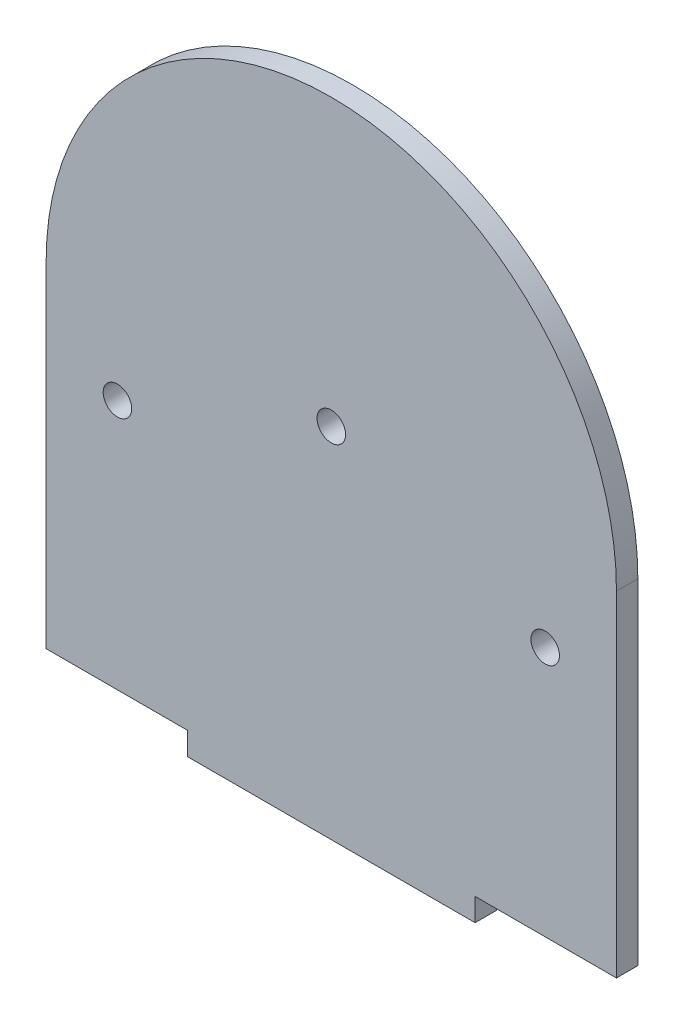
ISO-10303-21;
HEADER;
FILE_DESCRIPTION(('STEP AP214'),'2;1');
FILE_NAME('part.step','',(''),(''),'','','');
FILE_SCHEMA(('AUTOMOTIVE_DESIGN { 1 0 10303 214 1 1 1 1 }'));
ENDSEC;
DATA;
#1=APPLICATION_CONTEXT('core data for automotive mechanical design processes');
#2=APPLICATION_PROTOCOL_DEFINITION('international standard','automotive_design',2000,#1);
#3=PRODUCT_CONTEXT('',#1,'mechanical');
#4=PRODUCT('Part','Part','',(#3));
#5=PRODUCT_RELATED_PRODUCT_CATEGORY('part','',(#4));
#6=PRODUCT_DEFINITION_FORMATION('','',#4);
#7=PRODUCT_DEFINITION_CONTEXT('part definition',#1,'design');
#8=PRODUCT_DEFINITION('design','',#6,#7);
#9=PRODUCT_DEFINITION_SHAPE('','',#8);
#10=(LENGTH_UNIT() NAMED_UNIT(*) SI_UNIT(.MILLI.,.METRE.));
#11=(NAMED_UNIT(*) PLANE_ANGLE_UNIT() SI_UNIT($,.RADIAN.));
#12=(NAMED_UNIT(*) SI_UNIT($,.STERADIAN.) SOLID_ANGLE_UNIT());
#13=UNCERTAINTY_MEASURE_WITH_UNIT(LENGTH_MEASURE(1.E-05),#10,'distance_accuracy_value','');
#14=(GEOMETRIC_REPRESENTATION_CONTEXT(3) GLOBAL_UNCERTAINTY_ASSIGNED_CONTEXT((#13)) GLOBAL_UNIT_ASSIGNED_CONTEXT((#10,
#11,#12)) REPRESENTATION_CONTEXT('',''));
#15=CARTESIAN_POINT('',(0.,0.,0.));
#16=DIRECTION('',(0.,0.,1.));
#17=DIRECTION('',(1.,0.,0.));
#18=AXIS2_PLACEMENT_3D('',#15,#16,#17);
#19=CARTESIAN_POINT('',(0.,0.,3.));
#20=DIRECTION('',(0.,0.,1.));
#21=DIRECTION('',(1.,0.,0.));
#22=AXIS2_PLACEMENT_3D('',#19,#20,#21);
#23=PLANE('',#22);
#24=CARTESIAN_POINT('',(-30.,-11.85,3.));
#25=DIRECTION('',(0.,0.,1.));
#26=DIRECTION('',(1.,0.,0.));
#27=AXIS2_PLACEMENT_3D('',#24,#25,#26);
#28=CIRCLE('',#27,2.);
#29=CARTESIAN_POINT('',(-28.,-11.85,3.));
#30=VERTEX_POINT('',#29);
#31=EDGE_CURVE('E217',#30,#30,#28,.T.);
#32=ORIENTED_EDGE('',*,*,#31,.F.);
#33=EDGE_LOOP('',(#32));
#34=FACE_BOUND('',#33,.T.);
#35=DIRECTION('',(1.,0.,0.));
#36=VECTOR('',#35,1.);
#37=CARTESIAN_POINT('',(-20.175,-50.2,3.));
#38=LINE('',#37,#36);
#39=CARTESIAN_POINT('',(-20.175,-50.2,3.));
#40=VERTEX_POINT('',#39);
#41=CARTESIAN_POINT('',(20.175,-50.2,3.));
#42=VERTEX_POINT('',#41);
#43=EDGE_CURVE('E169',#40,#42,#38,.T.);
#44=ORIENTED_EDGE('',*,*,#43,.T.);
#45=DIRECTION('',(0.,1.,0.));
#46=VECTOR('',#45,1.);
#47=CARTESIAN_POINT('',(20.175,-50.2,3.));
#48=LINE('',#47,#46);
#49=CARTESIAN_POINT('',(20.175,-47.,3.));
#50=VERTEX_POINT('',#49);
#51=EDGE_CURVE('E104',#42,#50,#48,.T.);
#52=ORIENTED_EDGE('',*,*,#51,.T.);
#53=DIRECTION('',(1.,0.,0.));
#54=VECTOR('',#53,1.);
#55=CARTESIAN_POINT('',(20.175,-47.,3.));
#56=LINE('',#55,#54);
#57=CARTESIAN_POINT('',(40.,-47.,3.));
#58=VERTEX_POINT('',#57);
#59=EDGE_CURVE('E190',#50,#58,#56,.T.);
#60=ORIENTED_EDGE('',*,*,#59,.T.);
#61=DIRECTION('',(0.,1.,0.));
#62=VECTOR('',#61,1.);
#63=CARTESIAN_POINT('',(40.,0.,3.));
#64=LINE('',#63,#62);
#65=CARTESIAN_POINT('',(40.,0.,3.));
#66=VERTEX_POINT('',#65);
#67=EDGE_CURVE('E203',#58,#66,#64,.T.);
#68=ORIENTED_EDGE('',*,*,#67,.T.);
#69=CARTESIAN_POINT('',(0.,0.,3.));
#70=DIRECTION('',(0.,0.,1.));
#71=DIRECTION('',(1.,0.,0.));
#72=AXIS2_PLACEMENT_3D('',#69,#70,#71);
#73=CIRCLE('',#72,40.);
#74=CARTESIAN_POINT('',(-40.,0.,3.));
#75=VERTEX_POINT('',#74);
#76=EDGE_CURVE('E123',#66,#75,#73,.T.);
#77=ORIENTED_EDGE('',*,*,#76,.T.);
#78=DIRECTION('',(0.,-1.,0.));
#79=VECTOR('',#78,1.);
#80=CARTESIAN_POINT('',(-40.,0.,3.));
#81=LINE('',#80,#79);
#82=CARTESIAN_POINT('',(-40.,-47.,3.));
#83=VERTEX_POINT('',#82);
#84=EDGE_CURVE('E117',#75,#83,#81,.T.);
#85=ORIENTED_EDGE('',*,*,#84,.T.);
#86=DIRECTION('',(1.,0.,0.));
#87=VECTOR('',#86,1.);
#88=CARTESIAN_POINT('',(-40.,-47.,3.));
#89=LINE('',#88,#87);
#90=CARTESIAN_POINT('',(-20.175,-47.,3.));
#91=VERTEX_POINT('',#90);
#92=EDGE_CURVE('E121',#83,#91,#89,.T.);
#93=ORIENTED_EDGE('',*,*,#92,.T.);
#94=DIRECTION('',(0.,-1.,0.));
#95=VECTOR('',#94,1.);
#96=CARTESIAN_POINT('',(-20.175,-47.,3.));
#97=LINE('',#96,#95);
#98=EDGE_CURVE('E61',#91,#40,#97,.T.);
#99=ORIENTED_EDGE('',*,*,#98,.T.);
#100=EDGE_LOOP('',(#44,#52,#60,#68,#77,#85,#93,#99));
#101=FACE_BOUND('',#100,.T.);
#102=CARTESIAN_POINT('',(0.,0.,3.));
#103=DIRECTION('',(0.,0.,1.));
#104=DIRECTION('',(1.,0.,0.));
#105=AXIS2_PLACEMENT_3D('',#102,#103,#104);
#106=CIRCLE('',#105,2.);
#107=CARTESIAN_POINT('',(2.,0.,3.));
#108=VERTEX_POINT('',#107);
#109=EDGE_CURVE('E150',#108,#108,#106,.T.);
#110=ORIENTED_EDGE('',*,*,#109,.F.);
#111=EDGE_LOOP('',(#110));
#112=FACE_BOUND('',#111,.T.);
#113=CARTESIAN_POINT('',(30.,-11.85,3.));
#114=DIRECTION('',(0.,0.,1.));
#115=DIRECTION('',(-1.,0.,0.));
#116=AXIS2_PLACEMENT_3D('',#113,#114,#115);
#117=CIRCLE('',#116,2.);
#118=CARTESIAN_POINT('',(28.,-11.85,3.));
#119=VERTEX_POINT('',#118);
#120=EDGE_CURVE('E225',#119,#119,#117,.T.);
#121=ORIENTED_EDGE('',*,*,#120,.F.);
#122=EDGE_LOOP('',(#121));
#123=FACE_BOUND('',#122,.T.);
#124=ADVANCED_FACE('F43',(#34,#101,#112,#123),#23,.T.);
#125=CARTESIAN_POINT('',(0.,0.,0.));
#126=DIRECTION('',(0.,0.,1.));
#127=DIRECTION('',(1.,0.,0.));
#128=AXIS2_PLACEMENT_3D('',#125,#126,#127);
#129=PLANE('',#128);
#130=DIRECTION('',(1.,0.,0.));
#131=VECTOR('',#130,1.);
#132=CARTESIAN_POINT('',(-20.175,-50.2,0.));
#133=LINE('',#132,#131);
#134=CARTESIAN_POINT('',(-20.175,-50.2,0.));
#135=VERTEX_POINT('',#134);
#136=CARTESIAN_POINT('',(20.175,-50.2,0.));
#137=VERTEX_POINT('',#136);
#138=EDGE_CURVE('E145',#135,#137,#133,.T.);
#139=ORIENTED_EDGE('',*,*,#138,.F.);
#140=DIRECTION('',(0.,-1.,0.));
#141=VECTOR('',#140,1.);
#142=CARTESIAN_POINT('',(-20.175,-47.,0.));
#143=LINE('',#142,#141);
#144=CARTESIAN_POINT('',(-20.175,-47.,0.));
#145=VERTEX_POINT('',#144);
#146=EDGE_CURVE('E96',#145,#135,#143,.T.);
#147=ORIENTED_EDGE('',*,*,#146,.F.);
#148=DIRECTION('',(1.,0.,0.));
#149=VECTOR('',#148,1.);
#150=CARTESIAN_POINT('',(-40.,-47.,0.));
#151=LINE('',#150,#149);
#152=CARTESIAN_POINT('',(-40.,-47.,0.));
#153=VERTEX_POINT('',#152);
#154=EDGE_CURVE('E90',#153,#145,#151,.T.);
#155=ORIENTED_EDGE('',*,*,#154,.F.);
#156=DIRECTION('',(0.,-1.,0.));
#157=VECTOR('',#156,1.);
#158=CARTESIAN_POINT('',(-40.,0.,0.));
#159=LINE('',#158,#157);
#160=CARTESIAN_POINT('',(-40.,0.,0.));
#161=VERTEX_POINT('',#160);
#162=EDGE_CURVE('E132',#161,#153,#159,.T.);
#163=ORIENTED_EDGE('',*,*,#162,.F.);
#164=CARTESIAN_POINT('',(0.,0.,0.));
#165=DIRECTION('',(0.,0.,1.));
#166=DIRECTION('',(-1.,0.,0.));
#167=AXIS2_PLACEMENT_3D('',#164,#165,#166);
#168=CIRCLE('',#167,40.);
#169=CARTESIAN_POINT('',(40.,0.,0.));
#170=VERTEX_POINT('',#169);
#171=EDGE_CURVE('E160',#170,#161,#168,.T.);
#172=ORIENTED_EDGE('',*,*,#171,.F.);
#173=DIRECTION('',(0.,1.,0.));
#174=VECTOR('',#173,1.);
#175=CARTESIAN_POINT('',(40.,0.,0.));
#176=LINE('',#175,#174);
#177=CARTESIAN_POINT('',(40.,-47.,0.));
#178=VERTEX_POINT('',#177);
#179=EDGE_CURVE('E156',#178,#170,#176,.T.);
#180=ORIENTED_EDGE('',*,*,#179,.F.);
#181=DIRECTION('',(1.,0.,0.));
#182=VECTOR('',#181,1.);
#183=CARTESIAN_POINT('',(20.175,-47.,0.));
#184=LINE('',#183,#182);
#185=CARTESIAN_POINT('',(20.175,-47.,0.));
#186=VERTEX_POINT('',#185);
#187=EDGE_CURVE('E153',#186,#178,#184,.T.);
#188=ORIENTED_EDGE('',*,*,#187,.F.);
#189=DIRECTION('',(0.,1.,0.));
#190=VECTOR('',#189,1.);
#191=CARTESIAN_POINT('',(20.175,-50.2,0.));
#192=LINE('',#191,#190);
#193=EDGE_CURVE('E149',#137,#186,#192,.T.);
#194=ORIENTED_EDGE('',*,*,#193,.F.);
#195=EDGE_LOOP('',(#139,#147,#155,#163,#172,#180,#188,#194));
#196=FACE_BOUND('',#195,.T.);
#197=CARTESIAN_POINT('',(0.,0.,0.));
#198=DIRECTION('',(0.,0.,1.));
#199=DIRECTION('',(1.,0.,0.));
#200=AXIS2_PLACEMENT_3D('',#197,#198,#199);
#201=CIRCLE('',#200,2.);
#202=CARTESIAN_POINT('',(2.,0.,0.));
#203=VERTEX_POINT('',#202);
#204=EDGE_CURVE('E213',#203,#203,#201,.T.);
#205=ORIENTED_EDGE('',*,*,#204,.T.);
#206=EDGE_LOOP('',(#205));
#207=FACE_BOUND('',#206,.T.);
#208=CARTESIAN_POINT('',(-30.,-11.85,0.));
#209=DIRECTION('',(0.,0.,1.));
#210=DIRECTION('',(1.,0.,0.));
#211=AXIS2_PLACEMENT_3D('',#208,#209,#210);
#212=CIRCLE('',#211,2.);
#213=CARTESIAN_POINT('',(-28.,-11.85,0.));
#214=VERTEX_POINT('',#213);
#215=EDGE_CURVE('E221',#214,#214,#212,.T.);
#216=ORIENTED_EDGE('',*,*,#215,.T.);
#217=EDGE_LOOP('',(#216));
#218=FACE_BOUND('',#217,.T.);
#219=CARTESIAN_POINT('',(30.,-11.85,0.));
#220=DIRECTION('',(0.,0.,1.));
#221=DIRECTION('',(-1.,0.,0.));
#222=AXIS2_PLACEMENT_3D('',#219,#220,#221);
#223=CIRCLE('',#222,2.);
#224=CARTESIAN_POINT('',(28.,-11.85,0.));
#225=VERTEX_POINT('',#224);
#226=EDGE_CURVE('E229',#225,#225,#223,.T.);
#227=ORIENTED_EDGE('',*,*,#226,.T.);
#228=EDGE_LOOP('',(#227));
#229=FACE_BOUND('',#228,.T.);
#230=ADVANCED_FACE('F194',(#196,#207,#218,#229),#129,.F.);
#231=CARTESIAN_POINT('',(-20.175,-50.2,3.));
#232=DIRECTION('',(0.,1.,0.));
#233=DIRECTION('',(-1.,0.,0.));
#234=AXIS2_PLACEMENT_3D('',#231,#232,#233);
#235=PLANE('',#234);
#236=ORIENTED_EDGE('',*,*,#138,.T.);
#237=DIRECTION('',(0.,0.,-1.));
#238=VECTOR('',#237,1.);
#239=CARTESIAN_POINT('',(20.175,-50.2,3.));
#240=LINE('',#239,#238);
#241=EDGE_CURVE('E11',#42,#137,#240,.T.);
#242=ORIENTED_EDGE('',*,*,#241,.F.);
#243=ORIENTED_EDGE('',*,*,#43,.F.);
#244=DIRECTION('',(0.,0.,-1.));
#245=VECTOR('',#244,1.);
#246=CARTESIAN_POINT('',(-20.175,-50.2,3.));
#247=LINE('',#246,#245);
#248=EDGE_CURVE('E141',#40,#135,#247,.T.);
#249=ORIENTED_EDGE('',*,*,#248,.T.);
#250=EDGE_LOOP('',(#236,#242,#243,#249));
#251=FACE_BOUND('',#250,.T.);
#252=ADVANCED_FACE('F45',(#251),#235,.F.);
#253=CARTESIAN_POINT('',(20.175,-50.2,3.));
#254=DIRECTION('',(-1.,0.,0.));
#255=DIRECTION('',(0.,-1.,0.));
#256=AXIS2_PLACEMENT_3D('',#253,#254,#255);
#257=PLANE('',#256);
#258=ORIENTED_EDGE('',*,*,#193,.T.);
#259=DIRECTION('',(0.,0.,-1.));
#260=VECTOR('',#259,1.);
#261=CARTESIAN_POINT('',(20.175,-47.,3.));
#262=LINE('',#261,#260);
#263=EDGE_CURVE('E53',#50,#186,#262,.T.);
#264=ORIENTED_EDGE('',*,*,#263,.F.);
#265=ORIENTED_EDGE('',*,*,#51,.F.);
#266=ORIENTED_EDGE('',*,*,#241,.T.);
#267=EDGE_LOOP('',(#258,#264,#265,#266));
#268=FACE_BOUND('',#267,.T.);
#269=ADVANCED_FACE('F264',(#268),#257,.F.);
#270=CARTESIAN_POINT('',(20.175,-47.,3.));
#271=DIRECTION('',(0.,1.,0.));
#272=DIRECTION('',(0.,0.,1.));
#273=AXIS2_PLACEMENT_3D('',#270,#271,#272);
#274=PLANE('',#273);
#275=ORIENTED_EDGE('',*,*,#187,.T.);
#276=DIRECTION('',(0.,0.,-1.));
#277=VECTOR('',#276,1.);
#278=CARTESIAN_POINT('',(40.,-47.,3.));
#279=LINE('',#278,#277);
#280=EDGE_CURVE('E180',#58,#178,#279,.T.);
#281=ORIENTED_EDGE('',*,*,#280,.F.);
#282=ORIENTED_EDGE('',*,*,#59,.F.);
#283=ORIENTED_EDGE('',*,*,#263,.T.);
#284=EDGE_LOOP('',(#275,#281,#282,#283));
#285=FACE_BOUND('',#284,.T.);
#286=ADVANCED_FACE('F188',(#285),#274,.F.);
#287=CARTESIAN_POINT('',(40.,0.,3.));
#288=DIRECTION('',(-1.,0.,0.));
#289=DIRECTION('',(0.,-1.,0.));
#290=AXIS2_PLACEMENT_3D('',#287,#288,#289);
#291=PLANE('',#290);
#292=ORIENTED_EDGE('',*,*,#179,.T.);
#293=DIRECTION('',(0.,0.,-1.));
#294=VECTOR('',#293,1.);
#295=CARTESIAN_POINT('',(40.,0.,3.));
#296=LINE('',#295,#294);
#297=EDGE_CURVE('E176',#66,#170,#296,.T.);
#298=ORIENTED_EDGE('',*,*,#297,.F.);
#299=ORIENTED_EDGE('',*,*,#67,.F.);
#300=ORIENTED_EDGE('',*,*,#280,.T.);
#301=EDGE_LOOP('',(#292,#298,#299,#300));
#302=FACE_BOUND('',#301,.T.);
#303=ADVANCED_FACE('F198',(#302),#291,.F.);
#304=CARTESIAN_POINT('',(0.,0.,3.));
#305=DIRECTION('',(0.,0.,-1.));
#306=DIRECTION('',(-1.,0.,0.));
#307=AXIS2_PLACEMENT_3D('',#304,#305,#306);
#308=CYLINDRICAL_SURFACE('',#307,40.);
#309=ORIENTED_EDGE('',*,*,#171,.T.);
#310=DIRECTION('',(0.,0.,-1.));
#311=VECTOR('',#310,1.);
#312=CARTESIAN_POINT('',(-40.,0.,3.));
#313=LINE('',#312,#311);
#314=EDGE_CURVE('E134',#75,#161,#313,.T.);
#315=ORIENTED_EDGE('',*,*,#314,.F.);
#316=ORIENTED_EDGE('',*,*,#76,.F.);
#317=ORIENTED_EDGE('',*,*,#297,.T.);
#318=EDGE_LOOP('',(#309,#315,#316,#317));
#319=FACE_BOUND('',#318,.T.);
#320=ADVANCED_FACE('F201',(#319),#308,.T.);
#321=CARTESIAN_POINT('',(-40.,0.,3.));
#322=DIRECTION('',(1.,0.,0.));
#323=DIRECTION('',(0.,0.,-1.));
#324=AXIS2_PLACEMENT_3D('',#321,#322,#323);
#325=PLANE('',#324);
#326=ORIENTED_EDGE('',*,*,#162,.T.);
#327=DIRECTION('',(0.,0.,-1.));
#328=VECTOR('',#327,1.);
#329=CARTESIAN_POINT('',(-40.,-47.,3.));
#330=LINE('',#329,#328);
#331=EDGE_CURVE('E129',#83,#153,#330,.T.);
#332=ORIENTED_EDGE('',*,*,#331,.F.);
#333=ORIENTED_EDGE('',*,*,#84,.F.);
#334=ORIENTED_EDGE('',*,*,#314,.T.);
#335=EDGE_LOOP('',(#326,#332,#333,#334));
#336=FACE_BOUND('',#335,.T.);
#337=ADVANCED_FACE('F130',(#336),#325,.F.);
#338=CARTESIAN_POINT('',(-40.,-47.,3.));
#339=DIRECTION('',(0.,1.,0.));
#340=DIRECTION('',(0.,0.,1.));
#341=AXIS2_PLACEMENT_3D('',#338,#339,#340);
#342=PLANE('',#341);
#343=ORIENTED_EDGE('',*,*,#154,.T.);
#344=DIRECTION('',(0.,0.,-1.));
#345=VECTOR('',#344,1.);
#346=CARTESIAN_POINT('',(-20.175,-47.,3.));
#347=LINE('',#346,#345);
#348=EDGE_CURVE('E135',#91,#145,#347,.T.);
#349=ORIENTED_EDGE('',*,*,#348,.F.);
#350=ORIENTED_EDGE('',*,*,#92,.F.);
#351=ORIENTED_EDGE('',*,*,#331,.T.);
#352=EDGE_LOOP('',(#343,#349,#350,#351));
#353=FACE_BOUND('',#352,.T.);
#354=ADVANCED_FACE('F137',(#353),#342,.F.);
#355=CARTESIAN_POINT('',(-20.175,-47.,3.));
#356=DIRECTION('',(1.,0.,0.));
#357=DIRECTION('',(0.,1.,0.));
#358=AXIS2_PLACEMENT_3D('',#355,#356,#357);
#359=PLANE('',#358);
#360=ORIENTED_EDGE('',*,*,#146,.T.);
#361=ORIENTED_EDGE('',*,*,#248,.F.);
#362=ORIENTED_EDGE('',*,*,#98,.F.);
#363=ORIENTED_EDGE('',*,*,#348,.T.);
#364=EDGE_LOOP('',(#360,#361,#362,#363));
#365=FACE_BOUND('',#364,.T.);
#366=ADVANCED_FACE('F252',(#365),#359,.F.);
#367=CARTESIAN_POINT('',(0.,0.,3.));
#368=DIRECTION('',(0.,0.,-1.));
#369=DIRECTION('',(-1.,0.,0.));
#370=AXIS2_PLACEMENT_3D('',#367,#368,#369);
#371=CYLINDRICAL_SURFACE('',#370,2.);
#372=ORIENTED_EDGE('',*,*,#109,.T.);
#373=EDGE_LOOP('',(#372));
#374=FACE_BOUND('',#373,.T.);
#375=ORIENTED_EDGE('',*,*,#204,.F.);
#376=EDGE_LOOP('',(#375));
#377=FACE_BOUND('',#376,.T.);
#378=ADVANCED_FACE('F249',(#374,#377),#371,.F.);
#379=CARTESIAN_POINT('',(-30.,-11.85,3.));
#380=DIRECTION('',(0.,0.,-1.));
#381=DIRECTION('',(-1.,0.,0.));
#382=AXIS2_PLACEMENT_3D('',#379,#380,#381);
#383=CYLINDRICAL_SURFACE('',#382,2.);
#384=ORIENTED_EDGE('',*,*,#31,.T.);
#385=EDGE_LOOP('',(#384));
#386=FACE_BOUND('',#385,.T.);
#387=ORIENTED_EDGE('',*,*,#215,.F.);
#388=EDGE_LOOP('',(#387));
#389=FACE_BOUND('',#388,.T.);
#390=ADVANCED_FACE('F340',(#386,#389),#383,.F.);
#391=CARTESIAN_POINT('',(30.,-11.85,3.));
#392=DIRECTION('',(0.,0.,-1.));
#393=DIRECTION('',(-1.,0.,0.));
#394=AXIS2_PLACEMENT_3D('',#391,#392,#393);
#395=CYLINDRICAL_SURFACE('',#394,2.);
#396=ORIENTED_EDGE('',*,*,#120,.T.);
#397=EDGE_LOOP('',(#396));
#398=FACE_BOUND('',#397,.T.);
#399=ORIENTED_EDGE('',*,*,#226,.F.);
#400=EDGE_LOOP('',(#399));
#401=FACE_BOUND('',#400,.T.);
#402=ADVANCED_FACE('F237',(#398,#401),#395,.F.);
#403=CLOSED_SHELL('',(#124,#230,#252,#269,#286,#303,#320,#337,#354,#366,#378,#390,#402));
#404=MANIFOLD_SOLID_BREP('B2',#403);
#405=ADVANCED_BREP_SHAPE_REPRESENTATION('',(#18,#404),#14);
#406=SHAPE_DEFINITION_REPRESENTATION(#9,#405);
ENDSEC;
END-ISO-10303-21;
